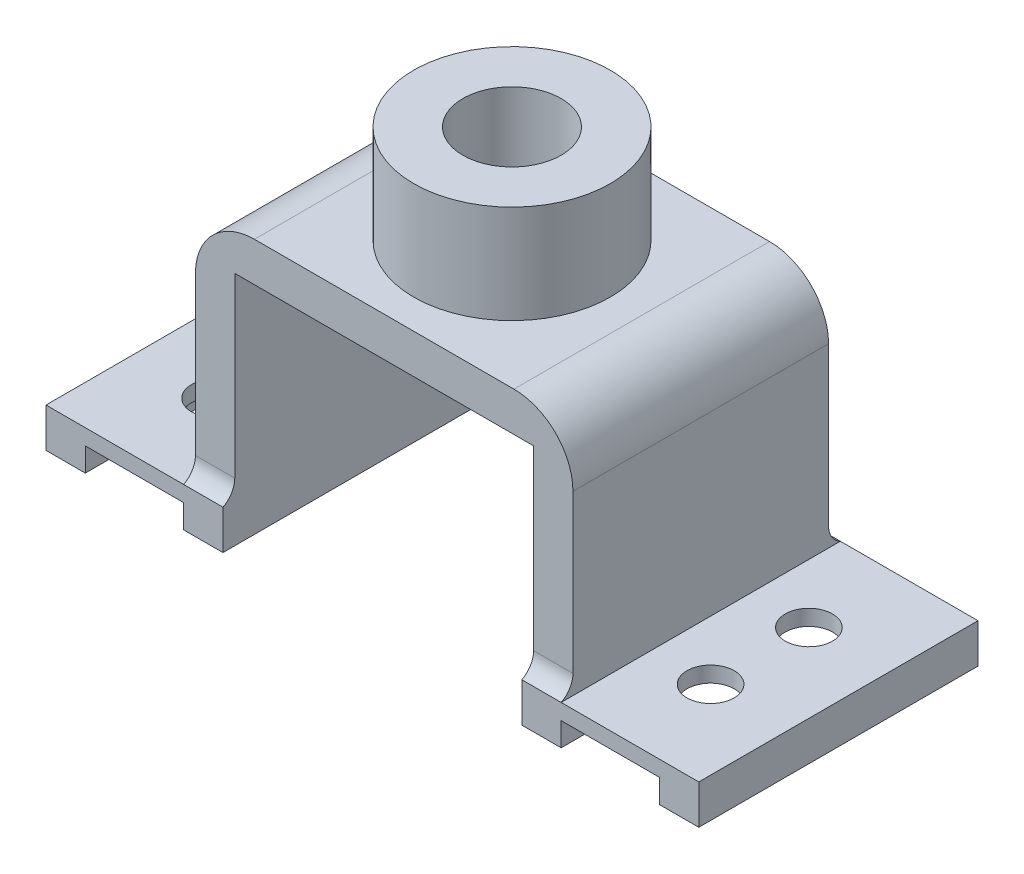
ISO-10303-21;
HEADER;
FILE_DESCRIPTION(('STEP AP214'),'2;1');
FILE_NAME('part.step','',(''),(''),'','','');
FILE_SCHEMA(('AUTOMOTIVE_DESIGN { 1 0 10303 214 1 1 1 1 }'));
ENDSEC;
DATA;
#1=APPLICATION_CONTEXT('core data for automotive mechanical design processes');
#2=APPLICATION_PROTOCOL_DEFINITION('international standard','automotive_design',2000,#1);
#3=PRODUCT_CONTEXT('',#1,'mechanical');
#4=PRODUCT('Part','Part','',(#3));
#5=PRODUCT_RELATED_PRODUCT_CATEGORY('part','',(#4));
#6=PRODUCT_DEFINITION_FORMATION('','',#4);
#7=PRODUCT_DEFINITION_CONTEXT('part definition',#1,'design');
#8=PRODUCT_DEFINITION('design','',#6,#7);
#9=PRODUCT_DEFINITION_SHAPE('','',#8);
#10=(LENGTH_UNIT() NAMED_UNIT(*) SI_UNIT(.MILLI.,.METRE.));
#11=(NAMED_UNIT(*) PLANE_ANGLE_UNIT() SI_UNIT($,.RADIAN.));
#12=(NAMED_UNIT(*) SI_UNIT($,.STERADIAN.) SOLID_ANGLE_UNIT());
#13=UNCERTAINTY_MEASURE_WITH_UNIT(LENGTH_MEASURE(1.E-05),#10,'distance_accuracy_value','');
#14=(GEOMETRIC_REPRESENTATION_CONTEXT(3) GLOBAL_UNCERTAINTY_ASSIGNED_CONTEXT((#13)) GLOBAL_UNIT_ASSIGNED_CONTEXT((#10,
#11,#12)) REPRESENTATION_CONTEXT('',''));
#15=CARTESIAN_POINT('',(0.,0.,0.));
#16=DIRECTION('',(0.,0.,1.));
#17=DIRECTION('',(1.,0.,0.));
#18=AXIS2_PLACEMENT_3D('',#15,#16,#17);
#19=CARTESIAN_POINT('',(-48.,0.,32.5));
#20=DIRECTION('',(0.,1.,0.));
#21=DIRECTION('',(0.,0.,1.));
#22=AXIS2_PLACEMENT_3D('',#19,#20,#21);
#23=PLANE('',#22);
#24=DIRECTION('',(0.,0.,-1.));
#25=VECTOR('',#24,1.);
#26=CARTESIAN_POINT('',(-38.,0.,35.5));
#27=LINE('',#26,#25);
#28=CARTESIAN_POINT('',(-38.,0.,35.5));
#29=VERTEX_POINT('',#28);
#30=CARTESIAN_POINT('',(-38.,0.,-35.5));
#31=VERTEX_POINT('',#30);
#32=EDGE_CURVE('E352',#29,#31,#27,.T.);
#33=ORIENTED_EDGE('',*,*,#32,.F.);
#34=DIRECTION('',(-1.,0.,0.));
#35=VECTOR('',#34,1.);
#36=CARTESIAN_POINT('',(-48.,0.,35.5));
#37=LINE('',#36,#35);
#38=CARTESIAN_POINT('',(-48.,0.,35.5));
#39=VERTEX_POINT('',#38);
#40=EDGE_CURVE('E272',#29,#39,#37,.T.);
#41=ORIENTED_EDGE('',*,*,#40,.T.);
#42=DIRECTION('',(0.,0.,-1.));
#43=VECTOR('',#42,1.);
#44=CARTESIAN_POINT('',(-48.,0.,32.5));
#45=LINE('',#44,#43);
#46=CARTESIAN_POINT('',(-48.,0.,-35.5));
#47=VERTEX_POINT('',#46);
#48=EDGE_CURVE('E463',#39,#47,#45,.T.);
#49=ORIENTED_EDGE('',*,*,#48,.T.);
#50=DIRECTION('',(-1.,0.,0.));
#51=VECTOR('',#50,1.);
#52=CARTESIAN_POINT('',(-48.,0.,-35.5));
#53=LINE('',#52,#51);
#54=EDGE_CURVE('E271',#31,#47,#53,.T.);
#55=ORIENTED_EDGE('',*,*,#54,.F.);
#56=EDGE_LOOP('',(#33,#41,#49,#55));
#57=FACE_BOUND('',#56,.T.);
#58=ADVANCED_FACE('F45',(#57),#23,.F.);
#59=CARTESIAN_POINT('',(-48.,70.,32.5));
#60=DIRECTION('',(1.,0.,0.));
#61=DIRECTION('',(0.,1.,0.));
#62=AXIS2_PLACEMENT_3D('',#59,#60,#61);
#63=PLANE('',#62);
#64=DIRECTION('',(0.,-1.,0.));
#65=VECTOR('',#64,1.);
#66=CARTESIAN_POINT('',(-48.,70.,32.5));
#67=LINE('',#66,#65);
#68=CARTESIAN_POINT('',(-48.,55.,32.5));
#69=VERTEX_POINT('',#68);
#70=CARTESIAN_POINT('',(-48.,14.8989794855664,32.5));
#71=VERTEX_POINT('',#70);
#72=EDGE_CURVE('E438',#69,#71,#67,.T.);
#73=ORIENTED_EDGE('',*,*,#72,.F.);
#74=DIRECTION('',(0.,0.,-1.));
#75=VECTOR('',#74,1.);
#76=CARTESIAN_POINT('',(-48.,55.,-32.5));
#77=LINE('',#76,#75);
#78=CARTESIAN_POINT('',(-48.,55.,-32.5));
#79=VERTEX_POINT('',#78);
#80=EDGE_CURVE('E471',#69,#79,#77,.T.);
#81=ORIENTED_EDGE('',*,*,#80,.T.);
#82=DIRECTION('',(0.,-1.,0.));
#83=VECTOR('',#82,1.);
#84=CARTESIAN_POINT('',(-48.,70.,-32.5));
#85=LINE('',#84,#83);
#86=CARTESIAN_POINT('',(-48.,14.8989794855664,-32.5));
#87=VERTEX_POINT('',#86);
#88=EDGE_CURVE('E437',#79,#87,#85,.T.);
#89=ORIENTED_EDGE('',*,*,#88,.T.);
#90=CARTESIAN_POINT('',(-48.,14.8989794855664,-38.));
#91=DIRECTION('',(1.,0.,0.));
#92=DIRECTION('',(0.,1.,0.));
#93=AXIS2_PLACEMENT_3D('',#90,#91,#92);
#94=CIRCLE('',#93,5.5);
#95=CARTESIAN_POINT('',(-48.,10.,-35.5));
#96=VERTEX_POINT('',#95);
#97=EDGE_CURVE('E510',#87,#96,#94,.T.);
#98=ORIENTED_EDGE('',*,*,#97,.T.);
#99=DIRECTION('',(0.,0.,1.));
#100=VECTOR('',#99,1.);
#101=CARTESIAN_POINT('',(-48.,10.,32.5));
#102=LINE('',#101,#100);
#103=CARTESIAN_POINT('',(-48.,10.,35.5));
#104=VERTEX_POINT('',#103);
#105=EDGE_CURVE('E466',#96,#104,#102,.T.);
#106=ORIENTED_EDGE('',*,*,#105,.T.);
#107=CARTESIAN_POINT('',(-48.,14.8989794855664,38.));
#108=DIRECTION('',(1.,0.,0.));
#109=DIRECTION('',(0.,1.,0.));
#110=AXIS2_PLACEMENT_3D('',#107,#108,#109);
#111=CIRCLE('',#110,5.5);
#112=EDGE_CURVE('E523',#104,#71,#111,.T.);
#113=ORIENTED_EDGE('',*,*,#112,.T.);
#114=EDGE_LOOP('',(#73,#81,#89,#98,#106,#113));
#115=FACE_BOUND('',#114,.T.);
#116=ADVANCED_FACE('F605',(#115),#63,.F.);
#117=CARTESIAN_POINT('',(48.,70.,32.5));
#118=DIRECTION('',(1.,0.,0.));
#119=DIRECTION('',(0.,1.,0.));
#120=AXIS2_PLACEMENT_3D('',#117,#118,#119);
#121=PLANE('',#120);
#122=DIRECTION('',(0.,0.,-1.));
#123=VECTOR('',#122,1.);
#124=CARTESIAN_POINT('',(48.,0.,32.5));
#125=LINE('',#124,#123);
#126=CARTESIAN_POINT('',(48.,0.,35.5));
#127=VERTEX_POINT('',#126);
#128=CARTESIAN_POINT('',(48.,0.,-35.5));
#129=VERTEX_POINT('',#128);
#130=EDGE_CURVE('E450',#127,#129,#125,.T.);
#131=ORIENTED_EDGE('',*,*,#130,.T.);
#132=DIRECTION('',(0.,1.,0.));
#133=VECTOR('',#132,1.);
#134=CARTESIAN_POINT('',(48.,6.00000000000001,-35.5));
#135=LINE('',#134,#133);
#136=CARTESIAN_POINT('',(48.,6.00000000000001,-35.5));
#137=VERTEX_POINT('',#136);
#138=EDGE_CURVE('E389',#129,#137,#135,.T.);
#139=ORIENTED_EDGE('',*,*,#138,.T.);
#140=DIRECTION('',(0.,0.,-1.));
#141=VECTOR('',#140,1.);
#142=CARTESIAN_POINT('',(48.,6.00000000000001,35.5));
#143=LINE('',#142,#141);
#144=CARTESIAN_POINT('',(48.,6.00000000000001,35.5));
#145=VERTEX_POINT('',#144);
#146=EDGE_CURVE('E431',#145,#137,#143,.T.);
#147=ORIENTED_EDGE('',*,*,#146,.F.);
#148=DIRECTION('',(0.,1.,0.));
#149=VECTOR('',#148,1.);
#150=CARTESIAN_POINT('',(48.,6.00000000000001,35.5));
#151=LINE('',#150,#149);
#152=EDGE_CURVE('E360',#127,#145,#151,.T.);
#153=ORIENTED_EDGE('',*,*,#152,.F.);
#154=EDGE_LOOP('',(#131,#139,#147,#153));
#155=FACE_BOUND('',#154,.T.);
#156=ADVANCED_FACE('F688',(#155),#121,.T.);
#157=DIRECTION('',(0.,-1.,0.));
#158=VECTOR('',#157,1.);
#159=CARTESIAN_POINT('',(48.,70.,-32.5));
#160=LINE('',#159,#158);
#161=CARTESIAN_POINT('',(48.,55.,-32.5));
#162=VERTEX_POINT('',#161);
#163=CARTESIAN_POINT('',(48.,14.8989794855664,-32.5));
#164=VERTEX_POINT('',#163);
#165=EDGE_CURVE('E454',#162,#164,#160,.T.);
#166=ORIENTED_EDGE('',*,*,#165,.F.);
#167=DIRECTION('',(0.,0.,-1.));
#168=VECTOR('',#167,1.);
#169=CARTESIAN_POINT('',(48.,55.,32.5));
#170=LINE('',#169,#168);
#171=CARTESIAN_POINT('',(48.,55.,32.5));
#172=VERTEX_POINT('',#171);
#173=EDGE_CURVE('E494',#162,#172,#170,.F.);
#174=ORIENTED_EDGE('',*,*,#173,.T.);
#175=DIRECTION('',(0.,-1.,0.));
#176=VECTOR('',#175,1.);
#177=CARTESIAN_POINT('',(48.,70.,32.5));
#178=LINE('',#177,#176);
#179=CARTESIAN_POINT('',(48.,14.8989794855664,32.5));
#180=VERTEX_POINT('',#179);
#181=EDGE_CURVE('E441',#172,#180,#178,.T.);
#182=ORIENTED_EDGE('',*,*,#181,.T.);
#183=CARTESIAN_POINT('',(48.,14.8989794855664,38.));
#184=DIRECTION('',(1.,0.,0.));
#185=DIRECTION('',(0.,1.,0.));
#186=AXIS2_PLACEMENT_3D('',#183,#184,#185);
#187=CIRCLE('',#186,5.5);
#188=CARTESIAN_POINT('',(48.,10.,35.5));
#189=VERTEX_POINT('',#188);
#190=EDGE_CURVE('E63',#180,#189,#187,.F.);
#191=ORIENTED_EDGE('',*,*,#190,.T.);
#192=DIRECTION('',(0.,0.,-1.));
#193=VECTOR('',#192,1.);
#194=CARTESIAN_POINT('',(48.,10.,32.5));
#195=LINE('',#194,#193);
#196=CARTESIAN_POINT('',(48.,10.,-35.5));
#197=VERTEX_POINT('',#196);
#198=EDGE_CURVE('E434',#189,#197,#195,.T.);
#199=ORIENTED_EDGE('',*,*,#198,.T.);
#200=CARTESIAN_POINT('',(48.,14.8989794855664,-38.));
#201=DIRECTION('',(1.,0.,0.));
#202=DIRECTION('',(0.,1.,0.));
#203=AXIS2_PLACEMENT_3D('',#200,#201,#202);
#204=CIRCLE('',#203,5.5);
#205=EDGE_CURVE('E517',#197,#164,#204,.F.);
#206=ORIENTED_EDGE('',*,*,#205,.T.);
#207=EDGE_LOOP('',(#166,#174,#182,#191,#199,#206));
#208=FACE_BOUND('',#207,.T.);
#209=ADVANCED_FACE('F623',(#208),#121,.T.);
#210=CARTESIAN_POINT('',(0.,0.,32.5));
#211=DIRECTION('',(0.,0.,1.));
#212=DIRECTION('',(1.,0.,0.));
#213=AXIS2_PLACEMENT_3D('',#210,#211,#212);
#214=PLANE('',#213);
#215=ORIENTED_EDGE('',*,*,#72,.T.);
#216=DIRECTION('',(1.,0.,0.));
#217=VECTOR('',#216,1.);
#218=CARTESIAN_POINT('',(-38.,14.8989794855664,32.5));
#219=LINE('',#218,#217);
#220=CARTESIAN_POINT('',(-38.,14.8989794855664,32.5));
#221=VERTEX_POINT('',#220);
#222=EDGE_CURVE('E507',#71,#221,#219,.T.);
#223=ORIENTED_EDGE('',*,*,#222,.T.);
#224=DIRECTION('',(0.,-1.,0.));
#225=VECTOR('',#224,1.);
#226=CARTESIAN_POINT('',(-38.,0.,32.5));
#227=LINE('',#226,#225);
#228=CARTESIAN_POINT('',(-38.,60.,32.5));
#229=VERTEX_POINT('',#228);
#230=EDGE_CURVE('E242',#229,#221,#227,.T.);
#231=ORIENTED_EDGE('',*,*,#230,.F.);
#232=DIRECTION('',(-1.,0.,0.));
#233=VECTOR('',#232,1.);
#234=CARTESIAN_POINT('',(-38.,60.,32.5));
#235=LINE('',#234,#233);
#236=CARTESIAN_POINT('',(38.,60.,32.5));
#237=VERTEX_POINT('',#236);
#238=EDGE_CURVE('E241',#237,#229,#235,.T.);
#239=ORIENTED_EDGE('',*,*,#238,.F.);
#240=DIRECTION('',(0.,1.,0.));
#241=VECTOR('',#240,1.);
#242=CARTESIAN_POINT('',(38.,0.,32.5));
#243=LINE('',#242,#241);
#244=CARTESIAN_POINT('',(38.,14.8989794855664,32.5));
#245=VERTEX_POINT('',#244);
#246=EDGE_CURVE('E233',#245,#237,#243,.T.);
#247=ORIENTED_EDGE('',*,*,#246,.F.);
#248=DIRECTION('',(-1.,0.,0.));
#249=VECTOR('',#248,1.);
#250=CARTESIAN_POINT('',(48.,14.8989794855664,32.5));
#251=LINE('',#250,#249);
#252=EDGE_CURVE('E504',#245,#180,#251,.F.);
#253=ORIENTED_EDGE('',*,*,#252,.T.);
#254=ORIENTED_EDGE('',*,*,#181,.F.);
#255=CARTESIAN_POINT('',(33.,55.,32.5));
#256=DIRECTION('',(0.,0.,1.));
#257=DIRECTION('',(1.,0.,0.));
#258=AXIS2_PLACEMENT_3D('',#255,#256,#257);
#259=CIRCLE('',#258,15.);
#260=CARTESIAN_POINT('',(33.,70.,32.5));
#261=VERTEX_POINT('',#260);
#262=EDGE_CURVE('E488',#172,#261,#259,.T.);
#263=ORIENTED_EDGE('',*,*,#262,.T.);
#264=DIRECTION('',(1.,0.,0.));
#265=VECTOR('',#264,1.);
#266=CARTESIAN_POINT('',(-48.,70.,32.5));
#267=LINE('',#266,#265);
#268=CARTESIAN_POINT('',(-33.,70.,32.5));
#269=VERTEX_POINT('',#268);
#270=EDGE_CURVE('E446',#269,#261,#267,.T.);
#271=ORIENTED_EDGE('',*,*,#270,.F.);
#272=CARTESIAN_POINT('',(-33.,55.,32.5));
#273=DIRECTION('',(0.,0.,1.));
#274=DIRECTION('',(1.,0.,0.));
#275=AXIS2_PLACEMENT_3D('',#272,#273,#274);
#276=CIRCLE('',#275,15.);
#277=EDGE_CURVE('E491',#269,#69,#276,.T.);
#278=ORIENTED_EDGE('',*,*,#277,.T.);
#279=EDGE_LOOP('',(#215,#223,#231,#239,#247,#253,#254,#263,#271,#278));
#280=FACE_BOUND('',#279,.T.);
#281=ADVANCED_FACE('F256',(#280),#214,.T.);
#282=CARTESIAN_POINT('',(0.,0.,-32.5));
#283=DIRECTION('',(0.,0.,1.));
#284=DIRECTION('',(1.,0.,0.));
#285=AXIS2_PLACEMENT_3D('',#282,#283,#284);
#286=PLANE('',#285);
#287=DIRECTION('',(0.,-1.,0.));
#288=VECTOR('',#287,1.);
#289=CARTESIAN_POINT('',(-38.,0.,-32.5));
#290=LINE('',#289,#288);
#291=CARTESIAN_POINT('',(-38.,60.,-32.5));
#292=VERTEX_POINT('',#291);
#293=CARTESIAN_POINT('',(-38.,14.8989794855664,-32.5));
#294=VERTEX_POINT('',#293);
#295=EDGE_CURVE('E263',#292,#294,#290,.T.);
#296=ORIENTED_EDGE('',*,*,#295,.T.);
#297=DIRECTION('',(-1.,0.,0.));
#298=VECTOR('',#297,1.);
#299=CARTESIAN_POINT('',(0.,14.8989794855664,-32.5));
#300=LINE('',#299,#298);
#301=EDGE_CURVE('E500',#294,#87,#300,.T.);
#302=ORIENTED_EDGE('',*,*,#301,.T.);
#303=ORIENTED_EDGE('',*,*,#88,.F.);
#304=CARTESIAN_POINT('',(-33.,55.,-32.5));
#305=DIRECTION('',(0.,0.,1.));
#306=DIRECTION('',(1.,0.,0.));
#307=AXIS2_PLACEMENT_3D('',#304,#305,#306);
#308=CIRCLE('',#307,15.);
#309=CARTESIAN_POINT('',(-33.,70.,-32.5));
#310=VERTEX_POINT('',#309);
#311=EDGE_CURVE('E478',#79,#310,#308,.F.);
#312=ORIENTED_EDGE('',*,*,#311,.T.);
#313=DIRECTION('',(1.,0.,0.));
#314=VECTOR('',#313,1.);
#315=CARTESIAN_POINT('',(-48.,70.,-32.5));
#316=LINE('',#315,#314);
#317=CARTESIAN_POINT('',(33.,70.,-32.5));
#318=VERTEX_POINT('',#317);
#319=EDGE_CURVE('E442',#310,#318,#316,.T.);
#320=ORIENTED_EDGE('',*,*,#319,.T.);
#321=CARTESIAN_POINT('',(33.,55.,-32.5));
#322=DIRECTION('',(0.,0.,1.));
#323=DIRECTION('',(1.,0.,0.));
#324=AXIS2_PLACEMENT_3D('',#321,#322,#323);
#325=CIRCLE('',#324,15.);
#326=EDGE_CURVE('E475',#318,#162,#325,.F.);
#327=ORIENTED_EDGE('',*,*,#326,.T.);
#328=ORIENTED_EDGE('',*,*,#165,.T.);
#329=DIRECTION('',(1.,0.,0.));
#330=VECTOR('',#329,1.);
#331=CARTESIAN_POINT('',(0.,14.8989794855664,-32.5));
#332=LINE('',#331,#330);
#333=CARTESIAN_POINT('',(38.,14.8989794855664,-32.5));
#334=VERTEX_POINT('',#333);
#335=EDGE_CURVE('E497',#164,#334,#332,.F.);
#336=ORIENTED_EDGE('',*,*,#335,.T.);
#337=DIRECTION('',(0.,1.,0.));
#338=VECTOR('',#337,1.);
#339=CARTESIAN_POINT('',(38.,0.,-32.5));
#340=LINE('',#339,#338);
#341=CARTESIAN_POINT('',(38.,60.,-32.5));
#342=VERTEX_POINT('',#341);
#343=EDGE_CURVE('E268',#334,#342,#340,.T.);
#344=ORIENTED_EDGE('',*,*,#343,.T.);
#345=DIRECTION('',(-1.,0.,0.));
#346=VECTOR('',#345,1.);
#347=CARTESIAN_POINT('',(0.,60.,-32.5));
#348=LINE('',#347,#346);
#349=EDGE_CURVE('E251',#342,#292,#348,.T.);
#350=ORIENTED_EDGE('',*,*,#349,.T.);
#351=EDGE_LOOP('',(#296,#302,#303,#312,#320,#327,#328,#336,#344,#350));
#352=FACE_BOUND('',#351,.T.);
#353=ADVANCED_FACE('F602',(#352),#286,.F.);
#354=ORIENTED_EDGE('',*,*,#48,.F.);
#355=DIRECTION('',(0.,1.,0.));
#356=VECTOR('',#355,1.);
#357=CARTESIAN_POINT('',(-48.,6.00000000000001,35.5));
#358=LINE('',#357,#356);
#359=CARTESIAN_POINT('',(-48.,6.00000000000001,35.5));
#360=VERTEX_POINT('',#359);
#361=EDGE_CURVE('E302',#39,#360,#358,.T.);
#362=ORIENTED_EDGE('',*,*,#361,.T.);
#363=DIRECTION('',(0.,0.,-1.));
#364=VECTOR('',#363,1.);
#365=CARTESIAN_POINT('',(-48.,6.00000000000001,35.5));
#366=LINE('',#365,#364);
#367=CARTESIAN_POINT('',(-48.,6.00000000000001,-35.5));
#368=VERTEX_POINT('',#367);
#369=EDGE_CURVE('E306',#360,#368,#366,.T.);
#370=ORIENTED_EDGE('',*,*,#369,.T.);
#371=DIRECTION('',(0.,1.,0.));
#372=VECTOR('',#371,1.);
#373=CARTESIAN_POINT('',(-48.,6.00000000000001,-35.5));
#374=LINE('',#373,#372);
#375=EDGE_CURVE('E277',#47,#368,#374,.T.);
#376=ORIENTED_EDGE('',*,*,#375,.F.);
#377=EDGE_LOOP('',(#354,#362,#370,#376));
#378=FACE_BOUND('',#377,.T.);
#379=ADVANCED_FACE('F690',(#378),#63,.F.);
#380=DIRECTION('',(1.,0.,0.));
#381=VECTOR('',#380,1.);
#382=CARTESIAN_POINT('',(48.,0.,35.5));
#383=LINE('',#382,#381);
#384=CARTESIAN_POINT('',(38.,0.,35.5));
#385=VERTEX_POINT('',#384);
#386=EDGE_CURVE('E356',#385,#127,#383,.T.);
#387=ORIENTED_EDGE('',*,*,#386,.F.);
#388=DIRECTION('',(0.,0.,-1.));
#389=VECTOR('',#388,1.);
#390=CARTESIAN_POINT('',(38.,0.,35.5));
#391=LINE('',#390,#389);
#392=CARTESIAN_POINT('',(38.,0.,-35.5));
#393=VERTEX_POINT('',#392);
#394=EDGE_CURVE('E385',#385,#393,#391,.T.);
#395=ORIENTED_EDGE('',*,*,#394,.T.);
#396=DIRECTION('',(1.,0.,0.));
#397=VECTOR('',#396,1.);
#398=CARTESIAN_POINT('',(48.,0.,-35.5));
#399=LINE('',#398,#397);
#400=EDGE_CURVE('E355',#393,#129,#399,.T.);
#401=ORIENTED_EDGE('',*,*,#400,.T.);
#402=ORIENTED_EDGE('',*,*,#130,.F.);
#403=EDGE_LOOP('',(#387,#395,#401,#402));
#404=FACE_BOUND('',#403,.T.);
#405=ADVANCED_FACE('F665',(#404),#23,.F.);
#406=CARTESIAN_POINT('',(-48.,70.,32.5));
#407=DIRECTION('',(0.,1.,0.));
#408=DIRECTION('',(0.,0.,1.));
#409=AXIS2_PLACEMENT_3D('',#406,#407,#408);
#410=PLANE('',#409);
#411=CARTESIAN_POINT('',(0.,70.,0.));
#412=DIRECTION('',(0.,1.,0.));
#413=DIRECTION('',(0.,0.,1.));
#414=AXIS2_PLACEMENT_3D('',#411,#412,#413);
#415=CIRCLE('',#414,25.);
#416=CARTESIAN_POINT('',(0.,70.,25.));
#417=VERTEX_POINT('',#416);
#418=EDGE_CURVE('E568',#417,#417,#415,.T.);
#419=ORIENTED_EDGE('',*,*,#418,.F.);
#420=EDGE_LOOP('',(#419));
#421=FACE_BOUND('',#420,.T.);
#422=ORIENTED_EDGE('',*,*,#319,.F.);
#423=DIRECTION('',(0.,0.,-1.));
#424=VECTOR('',#423,1.);
#425=CARTESIAN_POINT('',(-33.,70.,32.5));
#426=LINE('',#425,#424);
#427=EDGE_CURVE('E485',#310,#269,#426,.F.);
#428=ORIENTED_EDGE('',*,*,#427,.T.);
#429=ORIENTED_EDGE('',*,*,#270,.T.);
#430=DIRECTION('',(0.,0.,-1.));
#431=VECTOR('',#430,1.);
#432=CARTESIAN_POINT('',(33.,70.,32.5));
#433=LINE('',#432,#431);
#434=EDGE_CURVE('E481',#261,#318,#433,.T.);
#435=ORIENTED_EDGE('',*,*,#434,.T.);
#436=EDGE_LOOP('',(#422,#428,#429,#435));
#437=FACE_BOUND('',#436,.T.);
#438=ADVANCED_FACE('F613',(#421,#437),#410,.T.);
#439=CARTESIAN_POINT('',(38.,0.,35.5));
#440=DIRECTION('',(1.,0.,0.));
#441=DIRECTION('',(0.,0.,-1.));
#442=AXIS2_PLACEMENT_3D('',#439,#440,#441);
#443=PLANE('',#442);
#444=ORIENTED_EDGE('',*,*,#394,.F.);
#445=DIRECTION('',(0.,-1.,0.));
#446=VECTOR('',#445,1.);
#447=CARTESIAN_POINT('',(38.,0.,35.5));
#448=LINE('',#447,#446);
#449=CARTESIAN_POINT('',(38.,10.,35.5));
#450=VERTEX_POINT('',#449);
#451=EDGE_CURVE('E381',#450,#385,#448,.T.);
#452=ORIENTED_EDGE('',*,*,#451,.F.);
#453=CARTESIAN_POINT('',(38.,14.8989794855664,38.));
#454=DIRECTION('',(1.,0.,0.));
#455=DIRECTION('',(0.,0.,-1.));
#456=AXIS2_PLACEMENT_3D('',#453,#454,#455);
#457=CIRCLE('',#456,5.5);
#458=EDGE_CURVE('E55',#450,#245,#457,.T.);
#459=ORIENTED_EDGE('',*,*,#458,.T.);
#460=ORIENTED_EDGE('',*,*,#246,.T.);
#461=DIRECTION('',(0.,0.,1.));
#462=VECTOR('',#461,1.);
#463=CARTESIAN_POINT('',(38.,60.,-35.5));
#464=LINE('',#463,#462);
#465=EDGE_CURVE('E237',#342,#237,#464,.T.);
#466=ORIENTED_EDGE('',*,*,#465,.F.);
#467=ORIENTED_EDGE('',*,*,#343,.F.);
#468=CARTESIAN_POINT('',(38.,14.8989794855664,-38.));
#469=DIRECTION('',(1.,0.,0.));
#470=DIRECTION('',(0.,0.,-1.));
#471=AXIS2_PLACEMENT_3D('',#468,#469,#470);
#472=CIRCLE('',#471,5.5);
#473=CARTESIAN_POINT('',(38.,10.,-35.5));
#474=VERTEX_POINT('',#473);
#475=EDGE_CURVE('E520',#334,#474,#472,.T.);
#476=ORIENTED_EDGE('',*,*,#475,.T.);
#477=DIRECTION('',(0.,-1.,0.));
#478=VECTOR('',#477,1.);
#479=CARTESIAN_POINT('',(38.,0.,-35.5));
#480=LINE('',#479,#478);
#481=EDGE_CURVE('E361',#474,#393,#480,.T.);
#482=ORIENTED_EDGE('',*,*,#481,.T.);
#483=EDGE_LOOP('',(#444,#452,#459,#460,#466,#467,#476,#482));
#484=FACE_BOUND('',#483,.T.);
#485=ADVANCED_FACE('F235',(#484),#443,.F.);
#486=CARTESIAN_POINT('',(73.,6.,35.5));
#487=DIRECTION('',(0.,1.,0.));
#488=DIRECTION('',(-1.,0.,0.));
#489=AXIS2_PLACEMENT_3D('',#486,#487,#488);
#490=PLANE('',#489);
#491=CARTESIAN_POINT('',(63.,6.,-12.5));
#492=DIRECTION('',(0.,1.,0.));
#493=DIRECTION('',(-1.,0.,0.));
#494=AXIS2_PLACEMENT_3D('',#491,#492,#493);
#495=CIRCLE('',#494,6.00000000000002);
#496=CARTESIAN_POINT('',(57.,6.,-12.5));
#497=VERTEX_POINT('',#496);
#498=EDGE_CURVE('E542',#497,#497,#495,.T.);
#499=ORIENTED_EDGE('',*,*,#498,.T.);
#500=EDGE_LOOP('',(#499));
#501=FACE_BOUND('',#500,.T.);
#502=CARTESIAN_POINT('',(63.,6.,12.5));
#503=DIRECTION('',(0.,1.,0.));
#504=DIRECTION('',(-1.,0.,0.));
#505=AXIS2_PLACEMENT_3D('',#502,#503,#504);
#506=CIRCLE('',#505,6.00000000000002);
#507=CARTESIAN_POINT('',(57.,6.,12.5));
#508=VERTEX_POINT('',#507);
#509=EDGE_CURVE('E560',#508,#508,#506,.T.);
#510=ORIENTED_EDGE('',*,*,#509,.T.);
#511=EDGE_LOOP('',(#510));
#512=FACE_BOUND('',#511,.T.);
#513=DIRECTION('',(1.,0.,0.));
#514=VECTOR('',#513,1.);
#515=CARTESIAN_POINT('',(73.,6.,-35.5));
#516=LINE('',#515,#514);
#517=CARTESIAN_POINT('',(73.,6.,-35.5));
#518=VERTEX_POINT('',#517);
#519=EDGE_CURVE('E393',#137,#518,#516,.T.);
#520=ORIENTED_EDGE('',*,*,#519,.T.);
#521=DIRECTION('',(0.,0.,-1.));
#522=VECTOR('',#521,1.);
#523=CARTESIAN_POINT('',(73.,6.,35.5));
#524=LINE('',#523,#522);
#525=CARTESIAN_POINT('',(73.,6.,35.5));
#526=VERTEX_POINT('',#525);
#527=EDGE_CURVE('E427',#526,#518,#524,.T.);
#528=ORIENTED_EDGE('',*,*,#527,.F.);
#529=DIRECTION('',(1.,0.,0.));
#530=VECTOR('',#529,1.);
#531=CARTESIAN_POINT('',(73.,6.,35.5));
#532=LINE('',#531,#530);
#533=EDGE_CURVE('E364',#145,#526,#532,.T.);
#534=ORIENTED_EDGE('',*,*,#533,.F.);
#535=ORIENTED_EDGE('',*,*,#146,.T.);
#536=EDGE_LOOP('',(#520,#528,#534,#535));
#537=FACE_BOUND('',#536,.T.);
#538=ADVANCED_FACE('F659',(#501,#512,#537),#490,.F.);
#539=CARTESIAN_POINT('',(73.,0.,35.5));
#540=DIRECTION('',(1.,0.,0.));
#541=DIRECTION('',(0.,0.,-1.));
#542=AXIS2_PLACEMENT_3D('',#539,#540,#541);
#543=PLANE('',#542);
#544=DIRECTION('',(0.,-1.,0.));
#545=VECTOR('',#544,1.);
#546=CARTESIAN_POINT('',(73.,0.,-35.5));
#547=LINE('',#546,#545);
#548=CARTESIAN_POINT('',(73.,0.,-35.5));
#549=VERTEX_POINT('',#548);
#550=EDGE_CURVE('E396',#518,#549,#547,.T.);
#551=ORIENTED_EDGE('',*,*,#550,.T.);
#552=DIRECTION('',(0.,0.,-1.));
#553=VECTOR('',#552,1.);
#554=CARTESIAN_POINT('',(73.,0.,35.5));
#555=LINE('',#554,#553);
#556=CARTESIAN_POINT('',(73.,0.,35.5));
#557=VERTEX_POINT('',#556);
#558=EDGE_CURVE('E423',#557,#549,#555,.T.);
#559=ORIENTED_EDGE('',*,*,#558,.F.);
#560=DIRECTION('',(0.,-1.,0.));
#561=VECTOR('',#560,1.);
#562=CARTESIAN_POINT('',(73.,0.,35.5));
#563=LINE('',#562,#561);
#564=EDGE_CURVE('E367',#526,#557,#563,.T.);
#565=ORIENTED_EDGE('',*,*,#564,.F.);
#566=ORIENTED_EDGE('',*,*,#527,.T.);
#567=EDGE_LOOP('',(#551,#559,#565,#566));
#568=FACE_BOUND('',#567,.T.);
#569=ADVANCED_FACE('F655',(#568),#543,.F.);
#570=CARTESIAN_POINT('',(83.,0.,35.5));
#571=DIRECTION('',(0.,1.,0.));
#572=DIRECTION('',(-1.,0.,0.));
#573=AXIS2_PLACEMENT_3D('',#570,#571,#572);
#574=PLANE('',#573);
#575=DIRECTION('',(1.,0.,0.));
#576=VECTOR('',#575,1.);
#577=CARTESIAN_POINT('',(83.,0.,-35.5));
#578=LINE('',#577,#576);
#579=CARTESIAN_POINT('',(83.,0.,-35.5));
#580=VERTEX_POINT('',#579);
#581=EDGE_CURVE('E399',#549,#580,#578,.T.);
#582=ORIENTED_EDGE('',*,*,#581,.T.);
#583=DIRECTION('',(0.,0.,-1.));
#584=VECTOR('',#583,1.);
#585=CARTESIAN_POINT('',(83.,0.,35.5));
#586=LINE('',#585,#584);
#587=CARTESIAN_POINT('',(83.,0.,35.5));
#588=VERTEX_POINT('',#587);
#589=EDGE_CURVE('E419',#588,#580,#586,.T.);
#590=ORIENTED_EDGE('',*,*,#589,.F.);
#591=DIRECTION('',(1.,0.,0.));
#592=VECTOR('',#591,1.);
#593=CARTESIAN_POINT('',(83.,0.,35.5));
#594=LINE('',#593,#592);
#595=EDGE_CURVE('E370',#557,#588,#594,.T.);
#596=ORIENTED_EDGE('',*,*,#595,.F.);
#597=ORIENTED_EDGE('',*,*,#558,.T.);
#598=EDGE_LOOP('',(#582,#590,#596,#597));
#599=FACE_BOUND('',#598,.T.);
#600=ADVANCED_FACE('F650',(#599),#574,.F.);
#601=CARTESIAN_POINT('',(83.,10.,35.5));
#602=DIRECTION('',(-1.,0.,0.));
#603=DIRECTION('',(0.,0.,1.));
#604=AXIS2_PLACEMENT_3D('',#601,#602,#603);
#605=PLANE('',#604);
#606=DIRECTION('',(0.,1.,0.));
#607=VECTOR('',#606,1.);
#608=CARTESIAN_POINT('',(83.,10.,-35.5));
#609=LINE('',#608,#607);
#610=CARTESIAN_POINT('',(83.,10.,-35.5));
#611=VERTEX_POINT('',#610);
#612=EDGE_CURVE('E402',#580,#611,#609,.T.);
#613=ORIENTED_EDGE('',*,*,#612,.T.);
#614=DIRECTION('',(0.,0.,-1.));
#615=VECTOR('',#614,1.);
#616=CARTESIAN_POINT('',(83.,10.,35.5));
#617=LINE('',#616,#615);
#618=CARTESIAN_POINT('',(83.,10.,35.5));
#619=VERTEX_POINT('',#618);
#620=EDGE_CURVE('E415',#619,#611,#617,.T.);
#621=ORIENTED_EDGE('',*,*,#620,.F.);
#622=DIRECTION('',(0.,1.,0.));
#623=VECTOR('',#622,1.);
#624=CARTESIAN_POINT('',(83.,10.,35.5));
#625=LINE('',#624,#623);
#626=EDGE_CURVE('E373',#588,#619,#625,.T.);
#627=ORIENTED_EDGE('',*,*,#626,.F.);
#628=ORIENTED_EDGE('',*,*,#589,.T.);
#629=EDGE_LOOP('',(#613,#621,#627,#628));
#630=FACE_BOUND('',#629,.T.);
#631=ADVANCED_FACE('F644',(#630),#605,.F.);
#632=CARTESIAN_POINT('',(38.,10.,35.5));
#633=DIRECTION('',(0.,-1.,0.));
#634=DIRECTION('',(0.,0.,-1.));
#635=AXIS2_PLACEMENT_3D('',#632,#633,#634);
#636=PLANE('',#635);
#637=CARTESIAN_POINT('',(63.,10.,-12.5));
#638=DIRECTION('',(0.,1.,0.));
#639=DIRECTION('',(0.,0.,1.));
#640=AXIS2_PLACEMENT_3D('',#637,#638,#639);
#641=CIRCLE('',#640,6.00000000000002);
#642=CARTESIAN_POINT('',(63.,10.,-6.49999999999998));
#643=VERTEX_POINT('',#642);
#644=EDGE_CURVE('E535',#643,#643,#641,.T.);
#645=ORIENTED_EDGE('',*,*,#644,.F.);
#646=EDGE_LOOP('',(#645));
#647=FACE_BOUND('',#646,.T.);
#648=CARTESIAN_POINT('',(63.,10.,12.5));
#649=DIRECTION('',(0.,1.,0.));
#650=DIRECTION('',(0.,0.,1.));
#651=AXIS2_PLACEMENT_3D('',#648,#649,#650);
#652=CIRCLE('',#651,6.00000000000002);
#653=CARTESIAN_POINT('',(63.,10.,18.5));
#654=VERTEX_POINT('',#653);
#655=EDGE_CURVE('E556',#654,#654,#652,.T.);
#656=ORIENTED_EDGE('',*,*,#655,.F.);
#657=EDGE_LOOP('',(#656));
#658=FACE_BOUND('',#657,.T.);
#659=DIRECTION('',(-1.,0.,0.));
#660=VECTOR('',#659,1.);
#661=CARTESIAN_POINT('',(38.,10.,-35.5));
#662=LINE('',#661,#660);
#663=EDGE_CURVE('E406',#611,#197,#662,.T.);
#664=ORIENTED_EDGE('',*,*,#663,.T.);
#665=ORIENTED_EDGE('',*,*,#198,.F.);
#666=DIRECTION('',(-1.,0.,0.));
#667=VECTOR('',#666,1.);
#668=CARTESIAN_POINT('',(38.,10.,35.5));
#669=LINE('',#668,#667);
#670=EDGE_CURVE('E377',#619,#189,#669,.T.);
#671=ORIENTED_EDGE('',*,*,#670,.F.);
#672=ORIENTED_EDGE('',*,*,#620,.T.);
#673=EDGE_LOOP('',(#664,#665,#671,#672));
#674=FACE_BOUND('',#673,.T.);
#675=ADVANCED_FACE('F639',(#647,#658,#674),#636,.F.);
#676=CARTESIAN_POINT('',(0.,0.,35.5));
#677=DIRECTION('',(0.,0.,-1.));
#678=DIRECTION('',(-1.,0.,0.));
#679=AXIS2_PLACEMENT_3D('',#676,#677,#678);
#680=PLANE('',#679);
#681=ORIENTED_EDGE('',*,*,#386,.T.);
#682=ORIENTED_EDGE('',*,*,#152,.T.);
#683=ORIENTED_EDGE('',*,*,#533,.T.);
#684=ORIENTED_EDGE('',*,*,#564,.T.);
#685=ORIENTED_EDGE('',*,*,#595,.T.);
#686=ORIENTED_EDGE('',*,*,#626,.T.);
#687=ORIENTED_EDGE('',*,*,#670,.T.);
#688=EDGE_CURVE('E376',#189,#450,#669,.T.);
#689=ORIENTED_EDGE('',*,*,#688,.T.);
#690=ORIENTED_EDGE('',*,*,#451,.T.);
#691=EDGE_LOOP('',(#681,#682,#683,#684,#685,#686,#687,#689,#690));
#692=FACE_BOUND('',#691,.T.);
#693=ADVANCED_FACE('F668',(#692),#680,.F.);
#694=CARTESIAN_POINT('',(0.,0.,-35.5));
#695=DIRECTION('',(0.,0.,-1.));
#696=DIRECTION('',(-1.,0.,0.));
#697=AXIS2_PLACEMENT_3D('',#694,#695,#696);
#698=PLANE('',#697);
#699=ORIENTED_EDGE('',*,*,#400,.F.);
#700=ORIENTED_EDGE('',*,*,#481,.F.);
#701=EDGE_CURVE('E405',#197,#474,#662,.T.);
#702=ORIENTED_EDGE('',*,*,#701,.F.);
#703=ORIENTED_EDGE('',*,*,#663,.F.);
#704=ORIENTED_EDGE('',*,*,#612,.F.);
#705=ORIENTED_EDGE('',*,*,#581,.F.);
#706=ORIENTED_EDGE('',*,*,#550,.F.);
#707=ORIENTED_EDGE('',*,*,#519,.F.);
#708=ORIENTED_EDGE('',*,*,#138,.F.);
#709=EDGE_LOOP('',(#699,#700,#702,#703,#704,#705,#706,#707,#708));
#710=FACE_BOUND('',#709,.T.);
#711=ADVANCED_FACE('F635',(#710),#698,.T.);
#712=CARTESIAN_POINT('',(-38.,0.,35.5));
#713=DIRECTION('',(1.,0.,0.));
#714=DIRECTION('',(0.,0.,-1.));
#715=AXIS2_PLACEMENT_3D('',#712,#713,#714);
#716=PLANE('',#715);
#717=DIRECTION('',(0.,-1.,0.));
#718=VECTOR('',#717,1.);
#719=CARTESIAN_POINT('',(-38.,0.,-35.5));
#720=LINE('',#719,#718);
#721=CARTESIAN_POINT('',(-38.,10.,-35.5));
#722=VERTEX_POINT('',#721);
#723=EDGE_CURVE('E310',#722,#31,#720,.T.);
#724=ORIENTED_EDGE('',*,*,#723,.F.);
#725=CARTESIAN_POINT('',(-38.,14.8989794855664,-38.));
#726=DIRECTION('',(1.,0.,0.));
#727=DIRECTION('',(0.,0.,-1.));
#728=AXIS2_PLACEMENT_3D('',#725,#726,#727);
#729=CIRCLE('',#728,5.5);
#730=EDGE_CURVE('E514',#722,#294,#729,.F.);
#731=ORIENTED_EDGE('',*,*,#730,.T.);
#732=ORIENTED_EDGE('',*,*,#295,.F.);
#733=DIRECTION('',(0.,0.,1.));
#734=VECTOR('',#733,1.);
#735=CARTESIAN_POINT('',(-38.,60.,-35.5));
#736=LINE('',#735,#734);
#737=EDGE_CURVE('E253',#292,#229,#736,.T.);
#738=ORIENTED_EDGE('',*,*,#737,.T.);
#739=ORIENTED_EDGE('',*,*,#230,.T.);
#740=CARTESIAN_POINT('',(-38.,14.8989794855664,38.));
#741=DIRECTION('',(1.,0.,0.));
#742=DIRECTION('',(0.,0.,-1.));
#743=AXIS2_PLACEMENT_3D('',#740,#741,#742);
#744=CIRCLE('',#743,5.5);
#745=CARTESIAN_POINT('',(-38.,10.,35.5));
#746=VERTEX_POINT('',#745);
#747=EDGE_CURVE('E526',#221,#746,#744,.F.);
#748=ORIENTED_EDGE('',*,*,#747,.T.);
#749=DIRECTION('',(0.,-1.,0.));
#750=VECTOR('',#749,1.);
#751=CARTESIAN_POINT('',(-38.,0.,35.5));
#752=LINE('',#751,#750);
#753=EDGE_CURVE('E276',#746,#29,#752,.T.);
#754=ORIENTED_EDGE('',*,*,#753,.T.);
#755=ORIENTED_EDGE('',*,*,#32,.T.);
#756=EDGE_LOOP('',(#724,#731,#732,#738,#739,#748,#754,#755));
#757=FACE_BOUND('',#756,.T.);
#758=ADVANCED_FACE('F579',(#757),#716,.T.);
#759=CARTESIAN_POINT('',(-38.,10.,35.5));
#760=DIRECTION('',(0.,1.,0.));
#761=DIRECTION('',(0.,0.,1.));
#762=AXIS2_PLACEMENT_3D('',#759,#760,#761);
#763=PLANE('',#762);
#764=CARTESIAN_POINT('',(-63.,10.,-12.5));
#765=DIRECTION('',(0.,1.,0.));
#766=DIRECTION('',(0.,0.,1.));
#767=AXIS2_PLACEMENT_3D('',#764,#765,#766);
#768=CIRCLE('',#767,6.00000000000001);
#769=CARTESIAN_POINT('',(-63.,10.,-6.49999999999999));
#770=VERTEX_POINT('',#769);
#771=EDGE_CURVE('E550',#770,#770,#768,.T.);
#772=ORIENTED_EDGE('',*,*,#771,.F.);
#773=EDGE_LOOP('',(#772));
#774=FACE_BOUND('',#773,.T.);
#775=CARTESIAN_POINT('',(-63.,10.,12.5));
#776=DIRECTION('',(0.,1.,0.));
#777=DIRECTION('',(0.,0.,1.));
#778=AXIS2_PLACEMENT_3D('',#775,#776,#777);
#779=CIRCLE('',#778,6.00000000000001);
#780=CARTESIAN_POINT('',(-63.,10.,18.5));
#781=VERTEX_POINT('',#780);
#782=EDGE_CURVE('E536',#781,#781,#779,.T.);
#783=ORIENTED_EDGE('',*,*,#782,.F.);
#784=EDGE_LOOP('',(#783));
#785=FACE_BOUND('',#784,.T.);
#786=ORIENTED_EDGE('',*,*,#105,.F.);
#787=DIRECTION('',(1.,0.,0.));
#788=VECTOR('',#787,1.);
#789=CARTESIAN_POINT('',(-38.,10.,-35.5));
#790=LINE('',#789,#788);
#791=CARTESIAN_POINT('',(-83.,10.,-35.5));
#792=VERTEX_POINT('',#791);
#793=EDGE_CURVE('E315',#792,#96,#790,.T.);
#794=ORIENTED_EDGE('',*,*,#793,.F.);
#795=DIRECTION('',(0.,0.,-1.));
#796=VECTOR('',#795,1.);
#797=CARTESIAN_POINT('',(-83.,10.,35.5));
#798=LINE('',#797,#796);
#799=CARTESIAN_POINT('',(-83.,10.,35.5));
#800=VERTEX_POINT('',#799);
#801=EDGE_CURVE('E349',#800,#792,#798,.T.);
#802=ORIENTED_EDGE('',*,*,#801,.F.);
#803=DIRECTION('',(1.,0.,0.));
#804=VECTOR('',#803,1.);
#805=CARTESIAN_POINT('',(-38.,10.,35.5));
#806=LINE('',#805,#804);
#807=EDGE_CURVE('E282',#800,#104,#806,.T.);
#808=ORIENTED_EDGE('',*,*,#807,.T.);
#809=EDGE_LOOP('',(#786,#794,#802,#808));
#810=FACE_BOUND('',#809,.T.);
#811=ADVANCED_FACE('F825',(#774,#785,#810),#763,.T.);
#812=CARTESIAN_POINT('',(-83.,10.,35.5));
#813=DIRECTION('',(-1.,0.,0.));
#814=DIRECTION('',(0.,0.,1.));
#815=AXIS2_PLACEMENT_3D('',#812,#813,#814);
#816=PLANE('',#815);
#817=DIRECTION('',(0.,1.,0.));
#818=VECTOR('',#817,1.);
#819=CARTESIAN_POINT('',(-83.,10.,-35.5));
#820=LINE('',#819,#818);
#821=CARTESIAN_POINT('',(-83.,0.,-35.5));
#822=VERTEX_POINT('',#821);
#823=EDGE_CURVE('E319',#822,#792,#820,.T.);
#824=ORIENTED_EDGE('',*,*,#823,.F.);
#825=DIRECTION('',(0.,0.,-1.));
#826=VECTOR('',#825,1.);
#827=CARTESIAN_POINT('',(-83.,0.,35.5));
#828=LINE('',#827,#826);
#829=CARTESIAN_POINT('',(-83.,0.,35.5));
#830=VERTEX_POINT('',#829);
#831=EDGE_CURVE('E346',#830,#822,#828,.T.);
#832=ORIENTED_EDGE('',*,*,#831,.F.);
#833=DIRECTION('',(0.,1.,0.));
#834=VECTOR('',#833,1.);
#835=CARTESIAN_POINT('',(-83.,10.,35.5));
#836=LINE('',#835,#834);
#837=EDGE_CURVE('E286',#830,#800,#836,.T.);
#838=ORIENTED_EDGE('',*,*,#837,.T.);
#839=ORIENTED_EDGE('',*,*,#801,.T.);
#840=EDGE_LOOP('',(#824,#832,#838,#839));
#841=FACE_BOUND('',#840,.T.);
#842=ADVANCED_FACE('F822',(#841),#816,.T.);
#843=CARTESIAN_POINT('',(-83.,0.,35.5));
#844=DIRECTION('',(0.,-1.,0.));
#845=DIRECTION('',(1.,0.,0.));
#846=AXIS2_PLACEMENT_3D('',#843,#844,#845);
#847=PLANE('',#846);
#848=DIRECTION('',(-1.,0.,0.));
#849=VECTOR('',#848,1.);
#850=CARTESIAN_POINT('',(-83.,0.,-35.5));
#851=LINE('',#850,#849);
#852=CARTESIAN_POINT('',(-73.,0.,-35.5));
#853=VERTEX_POINT('',#852);
#854=EDGE_CURVE('E323',#853,#822,#851,.T.);
#855=ORIENTED_EDGE('',*,*,#854,.F.);
#856=DIRECTION('',(0.,0.,-1.));
#857=VECTOR('',#856,1.);
#858=CARTESIAN_POINT('',(-73.,0.,35.5));
#859=LINE('',#858,#857);
#860=CARTESIAN_POINT('',(-73.,0.,35.5));
#861=VERTEX_POINT('',#860);
#862=EDGE_CURVE('E343',#861,#853,#859,.T.);
#863=ORIENTED_EDGE('',*,*,#862,.F.);
#864=DIRECTION('',(-1.,0.,0.));
#865=VECTOR('',#864,1.);
#866=CARTESIAN_POINT('',(-83.,0.,35.5));
#867=LINE('',#866,#865);
#868=EDGE_CURVE('E290',#861,#830,#867,.T.);
#869=ORIENTED_EDGE('',*,*,#868,.T.);
#870=ORIENTED_EDGE('',*,*,#831,.T.);
#871=EDGE_LOOP('',(#855,#863,#869,#870));
#872=FACE_BOUND('',#871,.T.);
#873=ADVANCED_FACE('F818',(#872),#847,.T.);
#874=CARTESIAN_POINT('',(-73.,0.,35.5));
#875=DIRECTION('',(1.,0.,0.));
#876=DIRECTION('',(0.,0.,-1.));
#877=AXIS2_PLACEMENT_3D('',#874,#875,#876);
#878=PLANE('',#877);
#879=DIRECTION('',(0.,-1.,0.));
#880=VECTOR('',#879,1.);
#881=CARTESIAN_POINT('',(-73.,0.,-35.5));
#882=LINE('',#881,#880);
#883=CARTESIAN_POINT('',(-73.,6.,-35.5));
#884=VERTEX_POINT('',#883);
#885=EDGE_CURVE('E327',#884,#853,#882,.T.);
#886=ORIENTED_EDGE('',*,*,#885,.F.);
#887=DIRECTION('',(0.,0.,-1.));
#888=VECTOR('',#887,1.);
#889=CARTESIAN_POINT('',(-73.,6.,35.5));
#890=LINE('',#889,#888);
#891=CARTESIAN_POINT('',(-73.,6.,35.5));
#892=VERTEX_POINT('',#891);
#893=EDGE_CURVE('E340',#892,#884,#890,.T.);
#894=ORIENTED_EDGE('',*,*,#893,.F.);
#895=DIRECTION('',(0.,-1.,0.));
#896=VECTOR('',#895,1.);
#897=CARTESIAN_POINT('',(-73.,0.,35.5));
#898=LINE('',#897,#896);
#899=EDGE_CURVE('E294',#892,#861,#898,.T.);
#900=ORIENTED_EDGE('',*,*,#899,.T.);
#901=ORIENTED_EDGE('',*,*,#862,.T.);
#902=EDGE_LOOP('',(#886,#894,#900,#901));
#903=FACE_BOUND('',#902,.T.);
#904=ADVANCED_FACE('F815',(#903),#878,.T.);
#905=CARTESIAN_POINT('',(-73.,6.,35.5));
#906=DIRECTION('',(0.,-1.,0.));
#907=DIRECTION('',(1.,0.,0.));
#908=AXIS2_PLACEMENT_3D('',#905,#906,#907);
#909=PLANE('',#908);
#910=CARTESIAN_POINT('',(-63.,6.,-12.5));
#911=DIRECTION('',(0.,-1.,0.));
#912=DIRECTION('',(1.,0.,0.));
#913=AXIS2_PLACEMENT_3D('',#910,#911,#912);
#914=CIRCLE('',#913,6.00000000000001);
#915=CARTESIAN_POINT('',(-57.,6.,-12.5));
#916=VERTEX_POINT('',#915);
#917=EDGE_CURVE('E49',#916,#916,#914,.T.);
#918=ORIENTED_EDGE('',*,*,#917,.F.);
#919=EDGE_LOOP('',(#918));
#920=FACE_BOUND('',#919,.T.);
#921=CARTESIAN_POINT('',(-63.,6.,12.5));
#922=DIRECTION('',(0.,-1.,0.));
#923=DIRECTION('',(1.,0.,0.));
#924=AXIS2_PLACEMENT_3D('',#921,#922,#923);
#925=CIRCLE('',#924,6.00000000000001);
#926=CARTESIAN_POINT('',(-57.,6.,12.5));
#927=VERTEX_POINT('',#926);
#928=EDGE_CURVE('E532',#927,#927,#925,.T.);
#929=ORIENTED_EDGE('',*,*,#928,.F.);
#930=EDGE_LOOP('',(#929));
#931=FACE_BOUND('',#930,.T.);
#932=DIRECTION('',(-1.,0.,0.));
#933=VECTOR('',#932,1.);
#934=CARTESIAN_POINT('',(-73.,6.,-35.5));
#935=LINE('',#934,#933);
#936=EDGE_CURVE('E331',#368,#884,#935,.T.);
#937=ORIENTED_EDGE('',*,*,#936,.F.);
#938=ORIENTED_EDGE('',*,*,#369,.F.);
#939=DIRECTION('',(-1.,0.,0.));
#940=VECTOR('',#939,1.);
#941=CARTESIAN_POINT('',(-73.,6.,35.5));
#942=LINE('',#941,#940);
#943=EDGE_CURVE('E298',#360,#892,#942,.T.);
#944=ORIENTED_EDGE('',*,*,#943,.T.);
#945=ORIENTED_EDGE('',*,*,#893,.T.);
#946=EDGE_LOOP('',(#937,#938,#944,#945));
#947=FACE_BOUND('',#946,.T.);
#948=ADVANCED_FACE('F812',(#920,#931,#947),#909,.T.);
#949=CARTESIAN_POINT('',(0.,0.,35.5));
#950=DIRECTION('',(0.,0.,-1.));
#951=DIRECTION('',(1.,0.,0.));
#952=AXIS2_PLACEMENT_3D('',#949,#950,#951);
#953=PLANE('',#952);
#954=ORIENTED_EDGE('',*,*,#40,.F.);
#955=ORIENTED_EDGE('',*,*,#753,.F.);
#956=EDGE_CURVE('E281',#104,#746,#806,.T.);
#957=ORIENTED_EDGE('',*,*,#956,.F.);
#958=ORIENTED_EDGE('',*,*,#807,.F.);
#959=ORIENTED_EDGE('',*,*,#837,.F.);
#960=ORIENTED_EDGE('',*,*,#868,.F.);
#961=ORIENTED_EDGE('',*,*,#899,.F.);
#962=ORIENTED_EDGE('',*,*,#943,.F.);
#963=ORIENTED_EDGE('',*,*,#361,.F.);
#964=EDGE_LOOP('',(#954,#955,#957,#958,#959,#960,#961,#962,#963));
#965=FACE_BOUND('',#964,.T.);
#966=ADVANCED_FACE('F809',(#965),#953,.F.);
#967=CARTESIAN_POINT('',(0.,0.,-35.5));
#968=DIRECTION('',(0.,0.,-1.));
#969=DIRECTION('',(1.,0.,0.));
#970=AXIS2_PLACEMENT_3D('',#967,#968,#969);
#971=PLANE('',#970);
#972=ORIENTED_EDGE('',*,*,#54,.T.);
#973=ORIENTED_EDGE('',*,*,#375,.T.);
#974=ORIENTED_EDGE('',*,*,#936,.T.);
#975=ORIENTED_EDGE('',*,*,#885,.T.);
#976=ORIENTED_EDGE('',*,*,#854,.T.);
#977=ORIENTED_EDGE('',*,*,#823,.T.);
#978=ORIENTED_EDGE('',*,*,#793,.T.);
#979=EDGE_CURVE('E314',#96,#722,#790,.T.);
#980=ORIENTED_EDGE('',*,*,#979,.T.);
#981=ORIENTED_EDGE('',*,*,#723,.T.);
#982=EDGE_LOOP('',(#972,#973,#974,#975,#976,#977,#978,#980,#981));
#983=FACE_BOUND('',#982,.T.);
#984=ADVANCED_FACE('F593',(#983),#971,.T.);
#985=CARTESIAN_POINT('',(-38.,60.,-35.5));
#986=DIRECTION('',(0.,1.,0.));
#987=DIRECTION('',(0.,0.,1.));
#988=AXIS2_PLACEMENT_3D('',#985,#986,#987);
#989=PLANE('',#988);
#990=ORIENTED_EDGE('',*,*,#465,.T.);
#991=ORIENTED_EDGE('',*,*,#238,.T.);
#992=ORIENTED_EDGE('',*,*,#737,.F.);
#993=ORIENTED_EDGE('',*,*,#349,.F.);
#994=EDGE_LOOP('',(#990,#991,#992,#993));
#995=FACE_BOUND('',#994,.T.);
#996=ADVANCED_FACE('F247',(#995),#989,.F.);
#997=CARTESIAN_POINT('',(-33.,55.,32.5));
#998=DIRECTION('',(0.,0.,1.));
#999=DIRECTION('',(1.,0.,0.));
#1000=AXIS2_PLACEMENT_3D('',#997,#998,#999);
#1001=CYLINDRICAL_SURFACE('',#1000,15.);
#1002=ORIENTED_EDGE('',*,*,#277,.F.);
#1003=ORIENTED_EDGE('',*,*,#427,.F.);
#1004=ORIENTED_EDGE('',*,*,#311,.F.);
#1005=ORIENTED_EDGE('',*,*,#80,.F.);
#1006=EDGE_LOOP('',(#1002,#1003,#1004,#1005));
#1007=FACE_BOUND('',#1006,.T.);
#1008=ADVANCED_FACE('F609',(#1007),#1001,.T.);
#1009=CARTESIAN_POINT('',(33.,55.,32.5));
#1010=DIRECTION('',(0.,0.,-1.));
#1011=DIRECTION('',(-1.,0.,0.));
#1012=AXIS2_PLACEMENT_3D('',#1009,#1010,#1011);
#1013=CYLINDRICAL_SURFACE('',#1012,15.);
#1014=ORIENTED_EDGE('',*,*,#262,.F.);
#1015=ORIENTED_EDGE('',*,*,#173,.F.);
#1016=ORIENTED_EDGE('',*,*,#326,.F.);
#1017=ORIENTED_EDGE('',*,*,#434,.F.);
#1018=EDGE_LOOP('',(#1014,#1015,#1016,#1017));
#1019=FACE_BOUND('',#1018,.T.);
#1020=ADVANCED_FACE('F618',(#1019),#1013,.T.);
#1021=CARTESIAN_POINT('',(-38.,14.8989794855664,-38.));
#1022=DIRECTION('',(-1.,0.,0.));
#1023=DIRECTION('',(0.,0.,1.));
#1024=AXIS2_PLACEMENT_3D('',#1021,#1022,#1023);
#1025=CYLINDRICAL_SURFACE('',#1024,5.5);
#1026=ORIENTED_EDGE('',*,*,#730,.F.);
#1027=ORIENTED_EDGE('',*,*,#979,.F.);
#1028=ORIENTED_EDGE('',*,*,#97,.F.);
#1029=ORIENTED_EDGE('',*,*,#301,.F.);
#1030=EDGE_LOOP('',(#1026,#1027,#1028,#1029));
#1031=FACE_BOUND('',#1030,.T.);
#1032=ADVANCED_FACE('F599',(#1031),#1025,.F.);
#1033=CARTESIAN_POINT('',(38.,14.8989794855664,-38.));
#1034=DIRECTION('',(1.,0.,0.));
#1035=DIRECTION('',(0.,0.,-1.));
#1036=AXIS2_PLACEMENT_3D('',#1033,#1034,#1035);
#1037=CYLINDRICAL_SURFACE('',#1036,5.5);
#1038=ORIENTED_EDGE('',*,*,#475,.F.);
#1039=ORIENTED_EDGE('',*,*,#335,.F.);
#1040=ORIENTED_EDGE('',*,*,#205,.F.);
#1041=ORIENTED_EDGE('',*,*,#701,.T.);
#1042=EDGE_LOOP('',(#1038,#1039,#1040,#1041));
#1043=FACE_BOUND('',#1042,.T.);
#1044=ADVANCED_FACE('F630',(#1043),#1037,.F.);
#1045=CARTESIAN_POINT('',(-38.,14.8989794855664,38.));
#1046=DIRECTION('',(-1.,0.,0.));
#1047=DIRECTION('',(0.,0.,1.));
#1048=AXIS2_PLACEMENT_3D('',#1045,#1046,#1047);
#1049=CYLINDRICAL_SURFACE('',#1048,5.5);
#1050=ORIENTED_EDGE('',*,*,#747,.F.);
#1051=ORIENTED_EDGE('',*,*,#222,.F.);
#1052=ORIENTED_EDGE('',*,*,#112,.F.);
#1053=ORIENTED_EDGE('',*,*,#956,.T.);
#1054=EDGE_LOOP('',(#1050,#1051,#1052,#1053));
#1055=FACE_BOUND('',#1054,.T.);
#1056=ADVANCED_FACE('F584',(#1055),#1049,.F.);
#1057=CARTESIAN_POINT('',(38.,14.8989794855664,38.));
#1058=DIRECTION('',(1.,0.,0.));
#1059=DIRECTION('',(0.,0.,-1.));
#1060=AXIS2_PLACEMENT_3D('',#1057,#1058,#1059);
#1061=CYLINDRICAL_SURFACE('',#1060,5.5);
#1062=ORIENTED_EDGE('',*,*,#458,.F.);
#1063=ORIENTED_EDGE('',*,*,#688,.F.);
#1064=ORIENTED_EDGE('',*,*,#190,.F.);
#1065=ORIENTED_EDGE('',*,*,#252,.F.);
#1066=EDGE_LOOP('',(#1062,#1063,#1064,#1065));
#1067=FACE_BOUND('',#1066,.T.);
#1068=ADVANCED_FACE('F47',(#1067),#1061,.F.);
#1069=CARTESIAN_POINT('',(0.,95.,0.));
#1070=DIRECTION('',(0.,1.,0.));
#1071=DIRECTION('',(0.,0.,1.));
#1072=AXIS2_PLACEMENT_3D('',#1069,#1070,#1071);
#1073=PLANE('',#1072);
#1074=CARTESIAN_POINT('',(0.,95.,0.));
#1075=DIRECTION('',(0.,1.,0.));
#1076=DIRECTION('',(0.,0.,1.));
#1077=AXIS2_PLACEMENT_3D('',#1074,#1075,#1076);
#1078=CIRCLE('',#1077,25.);
#1079=CARTESIAN_POINT('',(0.,95.,25.));
#1080=VERTEX_POINT('',#1079);
#1081=EDGE_CURVE('E569',#1080,#1080,#1078,.T.);
#1082=ORIENTED_EDGE('',*,*,#1081,.T.);
#1083=EDGE_LOOP('',(#1082));
#1084=FACE_BOUND('',#1083,.T.);
#1085=CARTESIAN_POINT('',(0.,95.,0.));
#1086=DIRECTION('',(0.,1.,0.));
#1087=DIRECTION('',(0.,0.,1.));
#1088=AXIS2_PLACEMENT_3D('',#1085,#1086,#1087);
#1089=CIRCLE('',#1088,12.5);
#1090=CARTESIAN_POINT('',(0.,95.,12.5));
#1091=VERTEX_POINT('',#1090);
#1092=EDGE_CURVE('E564',#1091,#1091,#1089,.T.);
#1093=ORIENTED_EDGE('',*,*,#1092,.F.);
#1094=EDGE_LOOP('',(#1093));
#1095=FACE_BOUND('',#1094,.T.);
#1096=ADVANCED_FACE('F671',(#1084,#1095),#1073,.T.);
#1097=CARTESIAN_POINT('',(0.,95.,0.));
#1098=DIRECTION('',(0.,-1.,0.));
#1099=DIRECTION('',(0.,0.,-1.));
#1100=AXIS2_PLACEMENT_3D('',#1097,#1098,#1099);
#1101=CYLINDRICAL_SURFACE('',#1100,25.);
#1102=ORIENTED_EDGE('',*,*,#1081,.F.);
#1103=EDGE_LOOP('',(#1102));
#1104=FACE_BOUND('',#1103,.T.);
#1105=ORIENTED_EDGE('',*,*,#418,.T.);
#1106=EDGE_LOOP('',(#1105));
#1107=FACE_BOUND('',#1106,.T.);
#1108=ADVANCED_FACE('F677',(#1104,#1107),#1101,.T.);
#1109=CARTESIAN_POINT('',(0.,95.,0.));
#1110=DIRECTION('',(0.,-1.,0.));
#1111=DIRECTION('',(0.,0.,-1.));
#1112=AXIS2_PLACEMENT_3D('',#1109,#1110,#1111);
#1113=CYLINDRICAL_SURFACE('',#1112,12.5);
#1114=ORIENTED_EDGE('',*,*,#1092,.T.);
#1115=EDGE_LOOP('',(#1114));
#1116=FACE_BOUND('',#1115,.T.);
#1117=CARTESIAN_POINT('',(0.,70.,0.));
#1118=DIRECTION('',(0.,1.,0.));
#1119=DIRECTION('',(0.,0.,1.));
#1120=AXIS2_PLACEMENT_3D('',#1117,#1118,#1119);
#1121=CIRCLE('',#1120,12.5);
#1122=CARTESIAN_POINT('',(0.,70.,12.5));
#1123=VERTEX_POINT('',#1122);
#1124=EDGE_CURVE('E11',#1123,#1123,#1121,.F.);
#1125=ORIENTED_EDGE('',*,*,#1124,.T.);
#1126=EDGE_LOOP('',(#1125));
#1127=FACE_BOUND('',#1126,.T.);
#1128=ADVANCED_FACE('F739',(#1116,#1127),#1113,.F.);
#1129=ORIENTED_EDGE('',*,*,#1124,.F.);
#1130=EDGE_LOOP('',(#1129));
#1131=FACE_BOUND('',#1130,.T.);
#1132=ADVANCED_FACE('F697',(#1131),#410,.T.);
#1133=CARTESIAN_POINT('',(63.,10.,12.5));
#1134=DIRECTION('',(0.,1.,0.));
#1135=DIRECTION('',(0.,0.,1.));
#1136=AXIS2_PLACEMENT_3D('',#1133,#1134,#1135);
#1137=CYLINDRICAL_SURFACE('',#1136,6.00000000000002);
#1138=ORIENTED_EDGE('',*,*,#655,.T.);
#1139=EDGE_LOOP('',(#1138));
#1140=FACE_BOUND('',#1139,.T.);
#1141=ORIENTED_EDGE('',*,*,#509,.F.);
#1142=EDGE_LOOP('',(#1141));
#1143=FACE_BOUND('',#1142,.T.);
#1144=ADVANCED_FACE('F738',(#1140,#1143),#1137,.F.);
#1145=CARTESIAN_POINT('',(63.,10.,-12.5));
#1146=DIRECTION('',(0.,1.,0.));
#1147=DIRECTION('',(0.,0.,1.));
#1148=AXIS2_PLACEMENT_3D('',#1145,#1146,#1147);
#1149=CYLINDRICAL_SURFACE('',#1148,6.00000000000002);
#1150=ORIENTED_EDGE('',*,*,#644,.T.);
#1151=EDGE_LOOP('',(#1150));
#1152=FACE_BOUND('',#1151,.T.);
#1153=ORIENTED_EDGE('',*,*,#498,.F.);
#1154=EDGE_LOOP('',(#1153));
#1155=FACE_BOUND('',#1154,.T.);
#1156=ADVANCED_FACE('F771',(#1152,#1155),#1149,.F.);
#1157=CARTESIAN_POINT('',(-63.,10.,12.5));
#1158=DIRECTION('',(0.,1.,0.));
#1159=DIRECTION('',(0.,0.,1.));
#1160=AXIS2_PLACEMENT_3D('',#1157,#1158,#1159);
#1161=CYLINDRICAL_SURFACE('',#1160,6.00000000000001);
#1162=ORIENTED_EDGE('',*,*,#928,.T.);
#1163=EDGE_LOOP('',(#1162));
#1164=FACE_BOUND('',#1163,.T.);
#1165=ORIENTED_EDGE('',*,*,#782,.T.);
#1166=EDGE_LOOP('',(#1165));
#1167=FACE_BOUND('',#1166,.T.);
#1168=ADVANCED_FACE('F782',(#1164,#1167),#1161,.F.);
#1169=CARTESIAN_POINT('',(-63.,10.,-12.5));
#1170=DIRECTION('',(0.,1.,0.));
#1171=DIRECTION('',(0.,0.,1.));
#1172=AXIS2_PLACEMENT_3D('',#1169,#1170,#1171);
#1173=CYLINDRICAL_SURFACE('',#1172,6.00000000000001);
#1174=ORIENTED_EDGE('',*,*,#917,.T.);
#1175=EDGE_LOOP('',(#1174));
#1176=FACE_BOUND('',#1175,.T.);
#1177=ORIENTED_EDGE('',*,*,#771,.T.);
#1178=EDGE_LOOP('',(#1177));
#1179=FACE_BOUND('',#1178,.T.);
#1180=ADVANCED_FACE('F793',(#1176,#1179),#1173,.F.);
#1181=CLOSED_SHELL('',(#58,#116,#156,#209,#281,#353,#379,#405,#438,#485,#538,#569,#600,#631,
#675,#693,#711,#758,#811,#842,#873,#904,#948,#966,#984,#996,#1008,#1020,#1032,#1044,#1056,#1068,
#1096,#1108,#1128,#1132,#1144,#1156,#1168,#1180));
#1182=MANIFOLD_SOLID_BREP('B2',#1181);
#1183=ADVANCED_BREP_SHAPE_REPRESENTATION('',(#18,#1182),#14);
#1184=SHAPE_DEFINITION_REPRESENTATION(#9,#1183);
ENDSEC;
END-ISO-10303-21;
